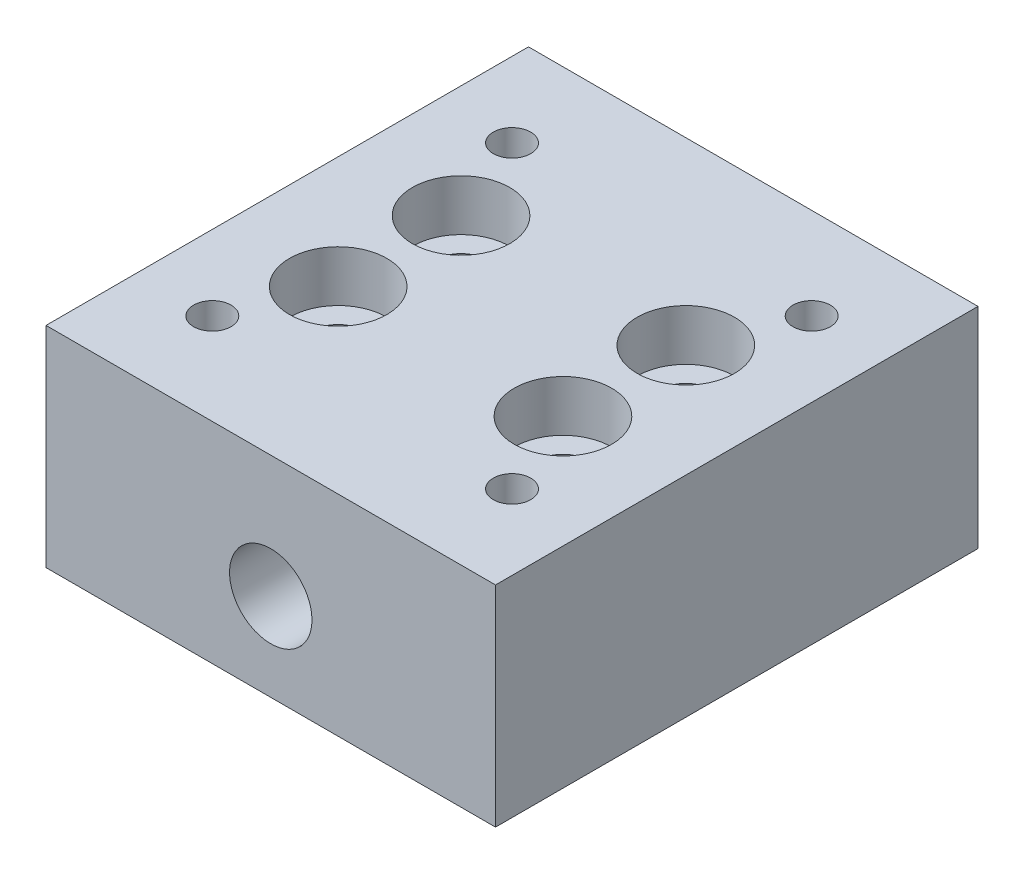
ISO-10303-21;
HEADER;
FILE_DESCRIPTION(('STEP AP214'),'2;1');
FILE_NAME('part.step','',(''),(''),'','','');
FILE_SCHEMA(('AUTOMOTIVE_DESIGN { 1 0 10303 214 1 1 1 1 }'));
ENDSEC;
DATA;
#1=APPLICATION_CONTEXT('core data for automotive mechanical design processes');
#2=APPLICATION_PROTOCOL_DEFINITION('international standard','automotive_design',2000,#1);
#3=PRODUCT_CONTEXT('',#1,'mechanical');
#4=PRODUCT('Part','Part','',(#3));
#5=PRODUCT_RELATED_PRODUCT_CATEGORY('part','',(#4));
#6=PRODUCT_DEFINITION_FORMATION('','',#4);
#7=PRODUCT_DEFINITION_CONTEXT('part definition',#1,'design');
#8=PRODUCT_DEFINITION('design','',#6,#7);
#9=PRODUCT_DEFINITION_SHAPE('','',#8);
#10=(LENGTH_UNIT() NAMED_UNIT(*) SI_UNIT(.MILLI.,.METRE.));
#11=(NAMED_UNIT(*) PLANE_ANGLE_UNIT() SI_UNIT($,.RADIAN.));
#12=(NAMED_UNIT(*) SI_UNIT($,.STERADIAN.) SOLID_ANGLE_UNIT());
#13=UNCERTAINTY_MEASURE_WITH_UNIT(LENGTH_MEASURE(1.E-05),#10,'distance_accuracy_value','');
#14=(GEOMETRIC_REPRESENTATION_CONTEXT(3) GLOBAL_UNCERTAINTY_ASSIGNED_CONTEXT((#13)) GLOBAL_UNIT_ASSIGNED_CONTEXT((#10,
#11,#12)) REPRESENTATION_CONTEXT('',''));
#15=CARTESIAN_POINT('',(0.,0.,0.));
#16=DIRECTION('',(0.,0.,1.));
#17=DIRECTION('',(1.,0.,0.));
#18=AXIS2_PLACEMENT_3D('',#15,#16,#17);
#19=CARTESIAN_POINT('',(0.,17.35,18.2724671640334));
#20=DIRECTION('',(0.,0.,1.));
#21=DIRECTION('',(1.,0.,0.));
#22=AXIS2_PLACEMENT_3D('',#19,#20,#21);
#23=CYLINDRICAL_SURFACE('',#22,2.75);
#24=CARTESIAN_POINT('',(0.,17.35,58.2506417570854));
#25=DIRECTION('',(0.,0.,1.));
#26=DIRECTION('',(1.,0.,0.));
#27=AXIS2_PLACEMENT_3D('',#24,#25,#26);
#28=CIRCLE('',#27,2.75);
#29=CARTESIAN_POINT('',(2.75,17.35,58.2506417570854));
#30=VERTEX_POINT('',#29);
#31=EDGE_CURVE('E173',#30,#30,#28,.T.);
#32=ORIENTED_EDGE('',*,*,#31,.T.);
#33=EDGE_LOOP('',(#32));
#34=FACE_BOUND('',#33,.T.);
#35=CARTESIAN_POINT('',(0.,17.35,48.0506417570856));
#36=DIRECTION('',(0.,0.,-1.));
#37=DIRECTION('',(0.,1.,0.));
#38=AXIS2_PLACEMENT_3D('',#35,#36,#37);
#39=CIRCLE('',#38,2.75);
#40=CARTESIAN_POINT('',(0.,20.1,48.0506417570856));
#41=VERTEX_POINT('',#40);
#42=EDGE_CURVE('E51',#41,#41,#39,.F.);
#43=ORIENTED_EDGE('',*,*,#42,.F.);
#44=EDGE_LOOP('',(#43));
#45=FACE_BOUND('',#44,.T.);
#46=ADVANCED_FACE('F47',(#34,#45),#23,.F.);
#47=CARTESIAN_POINT('',(2.5,17.3499999999999,32.0506417570856));
#48=DIRECTION('',(0.,0.,-1.));
#49=DIRECTION('',(0.,1.,0.));
#50=AXIS2_PLACEMENT_3D('',#47,#48,#49);
#51=PLANE('',#50);
#52=CARTESIAN_POINT('',(0.,17.35,32.0506417570856));
#53=DIRECTION('',(0.,0.,-1.));
#54=DIRECTION('',(0.,1.,0.));
#55=AXIS2_PLACEMENT_3D('',#52,#53,#54);
#56=CIRCLE('',#55,5.);
#57=CARTESIAN_POINT('',(0.,22.3499999999999,32.0506417570856));
#58=VERTEX_POINT('',#57);
#59=CARTESIAN_POINT('',(0.,12.3499999999999,32.0506417570855));
#60=VERTEX_POINT('',#59);
#61=EDGE_CURVE('E62',#58,#60,#56,.T.);
#62=ORIENTED_EDGE('',*,*,#61,.F.);
#63=DIRECTION('',(1.,0.,0.));
#64=VECTOR('',#63,1.);
#65=CARTESIAN_POINT('',(2.5,22.3499999999999,32.0506417570856));
#66=LINE('',#65,#64);
#67=CARTESIAN_POINT('',(2.5,22.3499999999999,32.0506417570856));
#68=VERTEX_POINT('',#67);
#69=EDGE_CURVE('E142',#58,#68,#66,.T.);
#70=ORIENTED_EDGE('',*,*,#69,.T.);
#71=CARTESIAN_POINT('',(2.5,17.3499999999999,32.0506417570856));
#72=DIRECTION('',(0.,0.,-1.));
#73=DIRECTION('',(0.,1.,0.));
#74=AXIS2_PLACEMENT_3D('',#71,#72,#73);
#75=CIRCLE('',#74,5.);
#76=CARTESIAN_POINT('',(2.5,12.3499999999999,32.0506417570855));
#77=VERTEX_POINT('',#76);
#78=EDGE_CURVE('E171',#68,#77,#75,.T.);
#79=ORIENTED_EDGE('',*,*,#78,.T.);
#80=DIRECTION('',(-1.,0.,0.));
#81=VECTOR('',#80,1.);
#82=CARTESIAN_POINT('',(2.5,12.3499999999999,32.0506417570855));
#83=LINE('',#82,#81);
#84=EDGE_CURVE('E145',#77,#60,#83,.T.);
#85=ORIENTED_EDGE('',*,*,#84,.T.);
#86=EDGE_LOOP('',(#62,#70,#79,#85));
#87=FACE_BOUND('',#86,.T.);
#88=ADVANCED_FACE('F140',(#87),#51,.T.);
#89=CARTESIAN_POINT('',(0.,11.5,0.));
#90=DIRECTION('',(0.,1.,0.));
#91=DIRECTION('',(0.,0.,1.));
#92=AXIS2_PLACEMENT_3D('',#89,#90,#91);
#93=PLANE('',#92);
#94=CARTESIAN_POINT('',(-7.5,11.5,38.0506417570854));
#95=DIRECTION('',(0.,1.,0.));
#96=DIRECTION('',(0.,0.,1.));
#97=AXIS2_PLACEMENT_3D('',#94,#95,#96);
#98=CIRCLE('',#97,1.7);
#99=CARTESIAN_POINT('',(-7.5,11.5,39.7506417570854));
#100=VERTEX_POINT('',#99);
#101=EDGE_CURVE('E205',#100,#100,#98,.F.);
#102=ORIENTED_EDGE('',*,*,#101,.F.);
#103=EDGE_LOOP('',(#102));
#104=FACE_BOUND('',#103,.T.);
#105=CARTESIAN_POINT('',(7.5,11.5,38.0506417570854));
#106=DIRECTION('',(0.,1.,0.));
#107=DIRECTION('',(0.,0.,1.));
#108=AXIS2_PLACEMENT_3D('',#105,#106,#107);
#109=CIRCLE('',#108,1.7);
#110=CARTESIAN_POINT('',(7.5,11.5,39.7506417570854));
#111=VERTEX_POINT('',#110);
#112=EDGE_CURVE('E229',#111,#111,#109,.F.);
#113=ORIENTED_EDGE('',*,*,#112,.F.);
#114=EDGE_LOOP('',(#113));
#115=FACE_BOUND('',#114,.T.);
#116=CARTESIAN_POINT('',(7.5,11.5,46.2506417570854));
#117=DIRECTION('',(0.,1.,0.));
#118=DIRECTION('',(0.,0.,1.));
#119=AXIS2_PLACEMENT_3D('',#116,#117,#118);
#120=CIRCLE('',#119,1.7);
#121=CARTESIAN_POINT('',(7.5,11.5,47.9506417570854));
#122=VERTEX_POINT('',#121);
#123=EDGE_CURVE('E241',#122,#122,#120,.F.);
#124=ORIENTED_EDGE('',*,*,#123,.F.);
#125=EDGE_LOOP('',(#124));
#126=FACE_BOUND('',#125,.T.);
#127=DIRECTION('',(0.,0.,1.));
#128=VECTOR('',#127,1.);
#129=CARTESIAN_POINT('',(-15.,11.5,26.0506417570854));
#130=LINE('',#129,#128);
#131=CARTESIAN_POINT('',(-15.,11.5,26.0506417570854));
#132=VERTEX_POINT('',#131);
#133=CARTESIAN_POINT('',(-15.,11.5,58.2506417570854));
#134=VERTEX_POINT('',#133);
#135=EDGE_CURVE('E244',#132,#134,#130,.T.);
#136=ORIENTED_EDGE('',*,*,#135,.F.);
#137=DIRECTION('',(-1.,0.,0.));
#138=VECTOR('',#137,1.);
#139=CARTESIAN_POINT('',(-15.,11.5,26.0506417570854));
#140=LINE('',#139,#138);
#141=CARTESIAN_POINT('',(15.,11.5,26.0506417570854));
#142=VERTEX_POINT('',#141);
#143=EDGE_CURVE('E257',#142,#132,#140,.T.);
#144=ORIENTED_EDGE('',*,*,#143,.F.);
#145=DIRECTION('',(0.,0.,-1.));
#146=VECTOR('',#145,1.);
#147=CARTESIAN_POINT('',(15.,11.5,26.0506417570854));
#148=LINE('',#147,#146);
#149=CARTESIAN_POINT('',(15.,11.5,58.2506417570854));
#150=VERTEX_POINT('',#149);
#151=EDGE_CURVE('E268',#150,#142,#148,.T.);
#152=ORIENTED_EDGE('',*,*,#151,.F.);
#153=DIRECTION('',(1.,0.,0.));
#154=VECTOR('',#153,1.);
#155=CARTESIAN_POINT('',(-15.,11.5,58.2506417570854));
#156=LINE('',#155,#154);
#157=EDGE_CURVE('E266',#134,#150,#156,.T.);
#158=ORIENTED_EDGE('',*,*,#157,.F.);
#159=EDGE_LOOP('',(#136,#144,#152,#158));
#160=FACE_BOUND('',#159,.T.);
#161=CARTESIAN_POINT('',(-7.5,11.5,46.2506417570854));
#162=DIRECTION('',(0.,1.,0.));
#163=DIRECTION('',(0.,0.,1.));
#164=AXIS2_PLACEMENT_3D('',#161,#162,#163);
#165=CIRCLE('',#164,1.7);
#166=CARTESIAN_POINT('',(-7.5,11.5,47.9506417570854));
#167=VERTEX_POINT('',#166);
#168=EDGE_CURVE('E217',#167,#167,#165,.F.);
#169=ORIENTED_EDGE('',*,*,#168,.F.);
#170=EDGE_LOOP('',(#169));
#171=FACE_BOUND('',#170,.T.);
#172=ADVANCED_FACE('F287',(#104,#115,#126,#160,#171),#93,.F.);
#173=CARTESIAN_POINT('',(-15.,25.5,26.0506417570854));
#174=DIRECTION('',(1.,0.,0.));
#175=DIRECTION('',(0.,0.,-1.));
#176=AXIS2_PLACEMENT_3D('',#173,#174,#175);
#177=PLANE('',#176);
#178=ORIENTED_EDGE('',*,*,#135,.T.);
#179=DIRECTION('',(0.,-1.,0.));
#180=VECTOR('',#179,1.);
#181=CARTESIAN_POINT('',(-15.,25.5,58.2506417570854));
#182=LINE('',#181,#180);
#183=CARTESIAN_POINT('',(-15.,25.5,58.2506417570854));
#184=VERTEX_POINT('',#183);
#185=EDGE_CURVE('E11',#184,#134,#182,.T.);
#186=ORIENTED_EDGE('',*,*,#185,.F.);
#187=DIRECTION('',(0.,0.,1.));
#188=VECTOR('',#187,1.);
#189=CARTESIAN_POINT('',(-15.,25.5,26.0506417570854));
#190=LINE('',#189,#188);
#191=CARTESIAN_POINT('',(-15.,25.5,26.0506417570854));
#192=VERTEX_POINT('',#191);
#193=EDGE_CURVE('E253',#192,#184,#190,.T.);
#194=ORIENTED_EDGE('',*,*,#193,.F.);
#195=DIRECTION('',(0.,-1.,0.));
#196=VECTOR('',#195,1.);
#197=CARTESIAN_POINT('',(-15.,25.5,26.0506417570854));
#198=LINE('',#197,#196);
#199=EDGE_CURVE('E263',#192,#132,#198,.T.);
#200=ORIENTED_EDGE('',*,*,#199,.T.);
#201=EDGE_LOOP('',(#178,#186,#194,#200));
#202=FACE_BOUND('',#201,.T.);
#203=ADVANCED_FACE('F49',(#202),#177,.F.);
#204=CARTESIAN_POINT('',(-15.,25.5,58.2506417570854));
#205=DIRECTION('',(0.,0.,-1.));
#206=DIRECTION('',(-1.,0.,0.));
#207=AXIS2_PLACEMENT_3D('',#204,#205,#206);
#208=PLANE('',#207);
#209=ORIENTED_EDGE('',*,*,#31,.F.);
#210=EDGE_LOOP('',(#209));
#211=FACE_BOUND('',#210,.T.);
#212=ORIENTED_EDGE('',*,*,#157,.T.);
#213=DIRECTION('',(0.,-1.,0.));
#214=VECTOR('',#213,1.);
#215=CARTESIAN_POINT('',(15.,25.5,58.2506417570854));
#216=LINE('',#215,#214);
#217=CARTESIAN_POINT('',(15.,25.5,58.2506417570854));
#218=VERTEX_POINT('',#217);
#219=EDGE_CURVE('E56',#218,#150,#216,.T.);
#220=ORIENTED_EDGE('',*,*,#219,.F.);
#221=DIRECTION('',(1.,0.,0.));
#222=VECTOR('',#221,1.);
#223=CARTESIAN_POINT('',(-15.,25.5,58.2506417570854));
#224=LINE('',#223,#222);
#225=EDGE_CURVE('E256',#184,#218,#224,.T.);
#226=ORIENTED_EDGE('',*,*,#225,.F.);
#227=ORIENTED_EDGE('',*,*,#185,.T.);
#228=EDGE_LOOP('',(#212,#220,#226,#227));
#229=FACE_BOUND('',#228,.T.);
#230=ADVANCED_FACE('F298',(#211,#229),#208,.F.);
#231=CARTESIAN_POINT('',(15.,25.5,26.0506417570854));
#232=DIRECTION('',(-1.,0.,0.));
#233=DIRECTION('',(0.,0.,1.));
#234=AXIS2_PLACEMENT_3D('',#231,#232,#233);
#235=PLANE('',#234);
#236=ORIENTED_EDGE('',*,*,#151,.T.);
#237=DIRECTION('',(0.,-1.,0.));
#238=VECTOR('',#237,1.);
#239=CARTESIAN_POINT('',(15.,25.5,26.0506417570854));
#240=LINE('',#239,#238);
#241=CARTESIAN_POINT('',(15.,25.5,26.0506417570854));
#242=VERTEX_POINT('',#241);
#243=EDGE_CURVE('E273',#242,#142,#240,.T.);
#244=ORIENTED_EDGE('',*,*,#243,.F.);
#245=DIRECTION('',(0.,0.,-1.));
#246=VECTOR('',#245,1.);
#247=CARTESIAN_POINT('',(15.,25.5,26.0506417570854));
#248=LINE('',#247,#246);
#249=EDGE_CURVE('E259',#218,#242,#248,.T.);
#250=ORIENTED_EDGE('',*,*,#249,.F.);
#251=ORIENTED_EDGE('',*,*,#219,.T.);
#252=EDGE_LOOP('',(#236,#244,#250,#251));
#253=FACE_BOUND('',#252,.T.);
#254=ADVANCED_FACE('F281',(#253),#235,.F.);
#255=CARTESIAN_POINT('',(-15.,25.5,26.0506417570854));
#256=DIRECTION('',(0.,0.,1.));
#257=DIRECTION('',(1.,0.,0.));
#258=AXIS2_PLACEMENT_3D('',#255,#256,#257);
#259=PLANE('',#258);
#260=DIRECTION('',(-1.,0.,0.));
#261=VECTOR('',#260,1.);
#262=CARTESIAN_POINT('',(2.5,12.35,26.0506417570855));
#263=LINE('',#262,#261);
#264=CARTESIAN_POINT('',(2.5,12.35,26.0506417570854));
#265=VERTEX_POINT('',#264);
#266=CARTESIAN_POINT('',(-2.5,12.35,26.0506417570855));
#267=VERTEX_POINT('',#266);
#268=EDGE_CURVE('E164',#265,#267,#263,.T.);
#269=ORIENTED_EDGE('',*,*,#268,.F.);
#270=CARTESIAN_POINT('',(2.5,17.35,26.0506417570856));
#271=DIRECTION('',(0.,0.,-1.));
#272=DIRECTION('',(0.,1.,0.));
#273=AXIS2_PLACEMENT_3D('',#270,#271,#272);
#274=CIRCLE('',#273,5.);
#275=CARTESIAN_POINT('',(2.5,22.35,26.0506417570856));
#276=VERTEX_POINT('',#275);
#277=EDGE_CURVE('E70',#276,#265,#274,.T.);
#278=ORIENTED_EDGE('',*,*,#277,.F.);
#279=DIRECTION('',(1.,0.,0.));
#280=VECTOR('',#279,1.);
#281=CARTESIAN_POINT('',(2.5,22.35,26.0506417570856));
#282=LINE('',#281,#280);
#283=CARTESIAN_POINT('',(-2.5,22.35,26.0506417570856));
#284=VERTEX_POINT('',#283);
#285=EDGE_CURVE('E169',#284,#276,#282,.T.);
#286=ORIENTED_EDGE('',*,*,#285,.F.);
#287=CARTESIAN_POINT('',(-2.5,17.35,26.0506417570856));
#288=DIRECTION('',(0.,0.,-1.));
#289=DIRECTION('',(0.,1.,0.));
#290=AXIS2_PLACEMENT_3D('',#287,#288,#289);
#291=CIRCLE('',#290,5.);
#292=EDGE_CURVE('E166',#267,#284,#291,.T.);
#293=ORIENTED_EDGE('',*,*,#292,.F.);
#294=EDGE_LOOP('',(#269,#278,#286,#293));
#295=FACE_BOUND('',#294,.T.);
#296=ORIENTED_EDGE('',*,*,#143,.T.);
#297=ORIENTED_EDGE('',*,*,#199,.F.);
#298=DIRECTION('',(-1.,0.,0.));
#299=VECTOR('',#298,1.);
#300=CARTESIAN_POINT('',(-15.,25.5,26.0506417570854));
#301=LINE('',#300,#299);
#302=EDGE_CURVE('E261',#242,#192,#301,.T.);
#303=ORIENTED_EDGE('',*,*,#302,.F.);
#304=ORIENTED_EDGE('',*,*,#243,.T.);
#305=EDGE_LOOP('',(#296,#297,#303,#304));
#306=FACE_BOUND('',#305,.T.);
#307=ADVANCED_FACE('F291',(#295,#306),#259,.F.);
#308=CARTESIAN_POINT('',(0.,25.5,0.));
#309=DIRECTION('',(0.,1.,0.));
#310=DIRECTION('',(0.,0.,1.));
#311=AXIS2_PLACEMENT_3D('',#308,#309,#310);
#312=PLANE('',#311);
#313=CARTESIAN_POINT('',(-9.99999999999999,25.4999999999997,32.1506417570854));
#314=DIRECTION('',(0.,1.,0.));
#315=DIRECTION('',(0.,0.,1.));
#316=AXIS2_PLACEMENT_3D('',#313,#314,#315);
#317=CIRCLE('',#316,1.25);
#318=CARTESIAN_POINT('',(-9.99999999999999,25.4999999999997,33.4006417570854));
#319=VERTEX_POINT('',#318);
#320=EDGE_CURVE('E180',#319,#319,#317,.T.);
#321=ORIENTED_EDGE('',*,*,#320,.F.);
#322=EDGE_LOOP('',(#321));
#323=FACE_BOUND('',#322,.T.);
#324=CARTESIAN_POINT('',(10.,25.4999999999997,32.1506417570854));
#325=DIRECTION('',(0.,1.,0.));
#326=DIRECTION('',(0.,0.,1.));
#327=AXIS2_PLACEMENT_3D('',#324,#325,#326);
#328=CIRCLE('',#327,1.25);
#329=CARTESIAN_POINT('',(10.,25.4999999999997,33.4006417570854));
#330=VERTEX_POINT('',#329);
#331=EDGE_CURVE('E186',#330,#330,#328,.T.);
#332=ORIENTED_EDGE('',*,*,#331,.F.);
#333=EDGE_LOOP('',(#332));
#334=FACE_BOUND('',#333,.T.);
#335=CARTESIAN_POINT('',(10.,25.4999999999995,52.1506417570854));
#336=DIRECTION('',(0.,1.,0.));
#337=DIRECTION('',(0.,0.,1.));
#338=AXIS2_PLACEMENT_3D('',#335,#336,#337);
#339=CIRCLE('',#338,1.25);
#340=CARTESIAN_POINT('',(10.,25.4999999999995,53.4006417570854));
#341=VERTEX_POINT('',#340);
#342=EDGE_CURVE('E192',#341,#341,#339,.T.);
#343=ORIENTED_EDGE('',*,*,#342,.F.);
#344=EDGE_LOOP('',(#343));
#345=FACE_BOUND('',#344,.T.);
#346=CARTESIAN_POINT('',(-9.99999999999999,25.4999999999995,52.1506417570854));
#347=DIRECTION('',(0.,1.,0.));
#348=DIRECTION('',(0.,0.,1.));
#349=AXIS2_PLACEMENT_3D('',#346,#347,#348);
#350=CIRCLE('',#349,1.25);
#351=CARTESIAN_POINT('',(-9.99999999999999,25.4999999999995,53.4006417570854));
#352=VERTEX_POINT('',#351);
#353=EDGE_CURVE('E198',#352,#352,#350,.T.);
#354=ORIENTED_EDGE('',*,*,#353,.F.);
#355=EDGE_LOOP('',(#354));
#356=FACE_BOUND('',#355,.T.);
#357=CARTESIAN_POINT('',(-7.5,25.4999999999996,38.0506417570854));
#358=DIRECTION('',(0.,1.,0.));
#359=DIRECTION('',(0.,0.,1.));
#360=AXIS2_PLACEMENT_3D('',#357,#358,#359);
#361=CIRCLE('',#360,3.25);
#362=CARTESIAN_POINT('',(-7.5,25.4999999999996,41.3006417570854));
#363=VERTEX_POINT('',#362);
#364=EDGE_CURVE('E204',#363,#363,#361,.T.);
#365=ORIENTED_EDGE('',*,*,#364,.F.);
#366=EDGE_LOOP('',(#365));
#367=FACE_BOUND('',#366,.T.);
#368=CARTESIAN_POINT('',(-7.5,25.4999999999995,46.2506417570854));
#369=DIRECTION('',(0.,1.,0.));
#370=DIRECTION('',(0.,0.,1.));
#371=AXIS2_PLACEMENT_3D('',#368,#369,#370);
#372=CIRCLE('',#371,3.25);
#373=CARTESIAN_POINT('',(-7.5,25.4999999999995,49.5006417570854));
#374=VERTEX_POINT('',#373);
#375=EDGE_CURVE('E208',#374,#374,#372,.T.);
#376=ORIENTED_EDGE('',*,*,#375,.F.);
#377=EDGE_LOOP('',(#376));
#378=FACE_BOUND('',#377,.T.);
#379=CARTESIAN_POINT('',(7.5,25.4999999999996,38.0506417570854));
#380=DIRECTION('',(0.,1.,0.));
#381=DIRECTION('',(0.,0.,1.));
#382=AXIS2_PLACEMENT_3D('',#379,#380,#381);
#383=CIRCLE('',#382,3.25);
#384=CARTESIAN_POINT('',(7.5,25.4999999999996,41.3006417570854));
#385=VERTEX_POINT('',#384);
#386=EDGE_CURVE('E220',#385,#385,#383,.T.);
#387=ORIENTED_EDGE('',*,*,#386,.F.);
#388=EDGE_LOOP('',(#387));
#389=FACE_BOUND('',#388,.T.);
#390=CARTESIAN_POINT('',(7.5,25.4999999999995,46.2506417570854));
#391=DIRECTION('',(0.,1.,0.));
#392=DIRECTION('',(0.,0.,1.));
#393=AXIS2_PLACEMENT_3D('',#390,#391,#392);
#394=CIRCLE('',#393,3.25);
#395=CARTESIAN_POINT('',(7.5,25.4999999999995,49.5006417570854));
#396=VERTEX_POINT('',#395);
#397=EDGE_CURVE('E232',#396,#396,#394,.T.);
#398=ORIENTED_EDGE('',*,*,#397,.F.);
#399=EDGE_LOOP('',(#398));
#400=FACE_BOUND('',#399,.T.);
#401=ORIENTED_EDGE('',*,*,#193,.T.);
#402=ORIENTED_EDGE('',*,*,#225,.T.);
#403=ORIENTED_EDGE('',*,*,#249,.T.);
#404=ORIENTED_EDGE('',*,*,#302,.T.);
#405=EDGE_LOOP('',(#401,#402,#403,#404));
#406=FACE_BOUND('',#405,.T.);
#407=ADVANCED_FACE('F297',(#323,#334,#345,#356,#367,#378,#389,#400,#406),#312,.T.);
#408=CARTESIAN_POINT('',(7.5,25.4999999999995,46.2506417570854));
#409=DIRECTION('',(0.,1.,0.));
#410=DIRECTION('',(0.,0.,1.));
#411=AXIS2_PLACEMENT_3D('',#408,#409,#410);
#412=CYLINDRICAL_SURFACE('',#411,1.7);
#413=ORIENTED_EDGE('',*,*,#123,.T.);
#414=EDGE_LOOP('',(#413));
#415=FACE_BOUND('',#414,.T.);
#416=CARTESIAN_POINT('',(7.5,22.0999999999995,46.2506417570854));
#417=DIRECTION('',(0.,1.,0.));
#418=DIRECTION('',(0.,0.,1.));
#419=AXIS2_PLACEMENT_3D('',#416,#417,#418);
#420=CIRCLE('',#419,1.7);
#421=CARTESIAN_POINT('',(7.5,22.0999999999995,47.9506417570854));
#422=VERTEX_POINT('',#421);
#423=EDGE_CURVE('E245',#422,#422,#420,.T.);
#424=ORIENTED_EDGE('',*,*,#423,.T.);
#425=EDGE_LOOP('',(#424));
#426=FACE_BOUND('',#425,.T.);
#427=ADVANCED_FACE('F397',(#415,#426),#412,.F.);
#428=CARTESIAN_POINT('',(9.2,22.0999999999995,46.2506417570854));
#429=DIRECTION('',(0.,-1.,0.));
#430=DIRECTION('',(0.,0.,-1.));
#431=AXIS2_PLACEMENT_3D('',#428,#429,#430);
#432=PLANE('',#431);
#433=ORIENTED_EDGE('',*,*,#423,.F.);
#434=EDGE_LOOP('',(#433));
#435=FACE_BOUND('',#434,.T.);
#436=CARTESIAN_POINT('',(7.5,22.0999999999995,46.2506417570854));
#437=DIRECTION('',(0.,1.,0.));
#438=DIRECTION('',(0.,0.,1.));
#439=AXIS2_PLACEMENT_3D('',#436,#437,#438);
#440=CIRCLE('',#439,3.25);
#441=CARTESIAN_POINT('',(7.5,22.0999999999995,49.5006417570854));
#442=VERTEX_POINT('',#441);
#443=EDGE_CURVE('E248',#442,#442,#440,.T.);
#444=ORIENTED_EDGE('',*,*,#443,.T.);
#445=EDGE_LOOP('',(#444));
#446=FACE_BOUND('',#445,.T.);
#447=ADVANCED_FACE('F393',(#435,#446),#432,.F.);
#448=CARTESIAN_POINT('',(7.5,25.4999999999995,46.2506417570854));
#449=DIRECTION('',(0.,1.,0.));
#450=DIRECTION('',(0.,0.,1.));
#451=AXIS2_PLACEMENT_3D('',#448,#449,#450);
#452=CYLINDRICAL_SURFACE('',#451,3.25);
#453=ORIENTED_EDGE('',*,*,#443,.F.);
#454=EDGE_LOOP('',(#453));
#455=FACE_BOUND('',#454,.T.);
#456=ORIENTED_EDGE('',*,*,#397,.T.);
#457=EDGE_LOOP('',(#456));
#458=FACE_BOUND('',#457,.T.);
#459=ADVANCED_FACE('F389',(#455,#458),#452,.F.);
#460=CARTESIAN_POINT('',(7.5,25.4999999999996,38.0506417570854));
#461=DIRECTION('',(0.,1.,0.));
#462=DIRECTION('',(0.,0.,1.));
#463=AXIS2_PLACEMENT_3D('',#460,#461,#462);
#464=CYLINDRICAL_SURFACE('',#463,1.7);
#465=ORIENTED_EDGE('',*,*,#112,.T.);
#466=EDGE_LOOP('',(#465));
#467=FACE_BOUND('',#466,.T.);
#468=CARTESIAN_POINT('',(7.5,22.0999999999996,38.0506417570854));
#469=DIRECTION('',(0.,1.,0.));
#470=DIRECTION('',(0.,0.,1.));
#471=AXIS2_PLACEMENT_3D('',#468,#469,#470);
#472=CIRCLE('',#471,1.7);
#473=CARTESIAN_POINT('',(7.5,22.0999999999996,39.7506417570854));
#474=VERTEX_POINT('',#473);
#475=EDGE_CURVE('E233',#474,#474,#472,.T.);
#476=ORIENTED_EDGE('',*,*,#475,.T.);
#477=EDGE_LOOP('',(#476));
#478=FACE_BOUND('',#477,.T.);
#479=ADVANCED_FACE('F385',(#467,#478),#464,.F.);
#480=CARTESIAN_POINT('',(9.2,22.0999999999996,38.0506417570854));
#481=DIRECTION('',(0.,-1.,0.));
#482=DIRECTION('',(0.,0.,-1.));
#483=AXIS2_PLACEMENT_3D('',#480,#481,#482);
#484=PLANE('',#483);
#485=ORIENTED_EDGE('',*,*,#475,.F.);
#486=EDGE_LOOP('',(#485));
#487=FACE_BOUND('',#486,.T.);
#488=CARTESIAN_POINT('',(7.5,22.0999999999996,38.0506417570854));
#489=DIRECTION('',(0.,1.,0.));
#490=DIRECTION('',(0.,0.,1.));
#491=AXIS2_PLACEMENT_3D('',#488,#489,#490);
#492=CIRCLE('',#491,3.25);
#493=CARTESIAN_POINT('',(7.5,22.0999999999996,41.3006417570854));
#494=VERTEX_POINT('',#493);
#495=EDGE_CURVE('E236',#494,#494,#492,.T.);
#496=ORIENTED_EDGE('',*,*,#495,.T.);
#497=EDGE_LOOP('',(#496));
#498=FACE_BOUND('',#497,.T.);
#499=ADVANCED_FACE('F381',(#487,#498),#484,.F.);
#500=CARTESIAN_POINT('',(7.5,25.4999999999996,38.0506417570854));
#501=DIRECTION('',(0.,1.,0.));
#502=DIRECTION('',(0.,0.,1.));
#503=AXIS2_PLACEMENT_3D('',#500,#501,#502);
#504=CYLINDRICAL_SURFACE('',#503,3.25);
#505=ORIENTED_EDGE('',*,*,#495,.F.);
#506=EDGE_LOOP('',(#505));
#507=FACE_BOUND('',#506,.T.);
#508=ORIENTED_EDGE('',*,*,#386,.T.);
#509=EDGE_LOOP('',(#508));
#510=FACE_BOUND('',#509,.T.);
#511=ADVANCED_FACE('F377',(#507,#510),#504,.F.);
#512=CARTESIAN_POINT('',(-7.5,25.4999999999995,46.2506417570854));
#513=DIRECTION('',(0.,1.,0.));
#514=DIRECTION('',(0.,0.,1.));
#515=AXIS2_PLACEMENT_3D('',#512,#513,#514);
#516=CYLINDRICAL_SURFACE('',#515,1.7);
#517=ORIENTED_EDGE('',*,*,#168,.T.);
#518=EDGE_LOOP('',(#517));
#519=FACE_BOUND('',#518,.T.);
#520=CARTESIAN_POINT('',(-7.5,22.0999999999995,46.2506417570854));
#521=DIRECTION('',(0.,1.,0.));
#522=DIRECTION('',(0.,0.,1.));
#523=AXIS2_PLACEMENT_3D('',#520,#521,#522);
#524=CIRCLE('',#523,1.7);
#525=CARTESIAN_POINT('',(-7.5,22.0999999999995,47.9506417570854));
#526=VERTEX_POINT('',#525);
#527=EDGE_CURVE('E221',#526,#526,#524,.T.);
#528=ORIENTED_EDGE('',*,*,#527,.T.);
#529=EDGE_LOOP('',(#528));
#530=FACE_BOUND('',#529,.T.);
#531=ADVANCED_FACE('F373',(#519,#530),#516,.F.);
#532=CARTESIAN_POINT('',(-5.8,22.0999999999995,46.2506417570854));
#533=DIRECTION('',(0.,-1.,0.));
#534=DIRECTION('',(0.,0.,-1.));
#535=AXIS2_PLACEMENT_3D('',#532,#533,#534);
#536=PLANE('',#535);
#537=ORIENTED_EDGE('',*,*,#527,.F.);
#538=EDGE_LOOP('',(#537));
#539=FACE_BOUND('',#538,.T.);
#540=CARTESIAN_POINT('',(-7.5,22.0999999999995,46.2506417570854));
#541=DIRECTION('',(0.,1.,0.));
#542=DIRECTION('',(0.,0.,1.));
#543=AXIS2_PLACEMENT_3D('',#540,#541,#542);
#544=CIRCLE('',#543,3.25);
#545=CARTESIAN_POINT('',(-7.5,22.0999999999995,49.5006417570854));
#546=VERTEX_POINT('',#545);
#547=EDGE_CURVE('E224',#546,#546,#544,.T.);
#548=ORIENTED_EDGE('',*,*,#547,.T.);
#549=EDGE_LOOP('',(#548));
#550=FACE_BOUND('',#549,.T.);
#551=ADVANCED_FACE('F369',(#539,#550),#536,.F.);
#552=CARTESIAN_POINT('',(-7.5,25.4999999999995,46.2506417570854));
#553=DIRECTION('',(0.,1.,0.));
#554=DIRECTION('',(0.,0.,1.));
#555=AXIS2_PLACEMENT_3D('',#552,#553,#554);
#556=CYLINDRICAL_SURFACE('',#555,3.25);
#557=ORIENTED_EDGE('',*,*,#547,.F.);
#558=EDGE_LOOP('',(#557));
#559=FACE_BOUND('',#558,.T.);
#560=ORIENTED_EDGE('',*,*,#375,.T.);
#561=EDGE_LOOP('',(#560));
#562=FACE_BOUND('',#561,.T.);
#563=ADVANCED_FACE('F365',(#559,#562),#556,.F.);
#564=CARTESIAN_POINT('',(-7.5,25.4999999999996,38.0506417570854));
#565=DIRECTION('',(0.,1.,0.));
#566=DIRECTION('',(0.,0.,1.));
#567=AXIS2_PLACEMENT_3D('',#564,#565,#566);
#568=CYLINDRICAL_SURFACE('',#567,1.7);
#569=ORIENTED_EDGE('',*,*,#101,.T.);
#570=EDGE_LOOP('',(#569));
#571=FACE_BOUND('',#570,.T.);
#572=CARTESIAN_POINT('',(-7.5,22.0999999999996,38.0506417570854));
#573=DIRECTION('',(0.,1.,0.));
#574=DIRECTION('',(0.,0.,1.));
#575=AXIS2_PLACEMENT_3D('',#572,#573,#574);
#576=CIRCLE('',#575,1.7);
#577=CARTESIAN_POINT('',(-7.5,22.0999999999996,39.7506417570854));
#578=VERTEX_POINT('',#577);
#579=EDGE_CURVE('E209',#578,#578,#576,.T.);
#580=ORIENTED_EDGE('',*,*,#579,.T.);
#581=EDGE_LOOP('',(#580));
#582=FACE_BOUND('',#581,.T.);
#583=ADVANCED_FACE('F361',(#571,#582),#568,.F.);
#584=CARTESIAN_POINT('',(-5.8,22.0999999999996,38.0506417570854));
#585=DIRECTION('',(0.,-1.,0.));
#586=DIRECTION('',(0.,0.,-1.));
#587=AXIS2_PLACEMENT_3D('',#584,#585,#586);
#588=PLANE('',#587);
#589=ORIENTED_EDGE('',*,*,#579,.F.);
#590=EDGE_LOOP('',(#589));
#591=FACE_BOUND('',#590,.T.);
#592=CARTESIAN_POINT('',(-7.5,22.0999999999996,38.0506417570854));
#593=DIRECTION('',(0.,1.,0.));
#594=DIRECTION('',(0.,0.,1.));
#595=AXIS2_PLACEMENT_3D('',#592,#593,#594);
#596=CIRCLE('',#595,3.25);
#597=CARTESIAN_POINT('',(-7.5,22.0999999999996,41.3006417570854));
#598=VERTEX_POINT('',#597);
#599=EDGE_CURVE('E212',#598,#598,#596,.T.);
#600=ORIENTED_EDGE('',*,*,#599,.T.);
#601=EDGE_LOOP('',(#600));
#602=FACE_BOUND('',#601,.T.);
#603=ADVANCED_FACE('F357',(#591,#602),#588,.F.);
#604=CARTESIAN_POINT('',(-7.5,25.4999999999996,38.0506417570854));
#605=DIRECTION('',(0.,1.,0.));
#606=DIRECTION('',(0.,0.,1.));
#607=AXIS2_PLACEMENT_3D('',#604,#605,#606);
#608=CYLINDRICAL_SURFACE('',#607,3.25);
#609=ORIENTED_EDGE('',*,*,#599,.F.);
#610=EDGE_LOOP('',(#609));
#611=FACE_BOUND('',#610,.T.);
#612=ORIENTED_EDGE('',*,*,#364,.T.);
#613=EDGE_LOOP('',(#612));
#614=FACE_BOUND('',#613,.T.);
#615=ADVANCED_FACE('F353',(#611,#614),#608,.F.);
#616=CARTESIAN_POINT('',(-9.99999999999999,16.9999999999995,52.1506417570854));
#617=DIRECTION('',(0.,1.,0.));
#618=DIRECTION('',(0.,0.,1.));
#619=AXIS2_PLACEMENT_3D('',#616,#617,#618);
#620=CONICAL_SURFACE('',#619,1.25,1.02974425867665);
#621=CARTESIAN_POINT('',(-10.,16.248924226215,52.1506417570854));
#622=VERTEX_POINT('',#621);
#623=VERTEX_LOOP('',#622);
#624=FACE_BOUND('',#623,.T.);
#625=CARTESIAN_POINT('',(-9.99999999999999,16.9999999999995,52.1506417570854));
#626=DIRECTION('',(0.,1.,0.));
#627=DIRECTION('',(0.,0.,1.));
#628=AXIS2_PLACEMENT_3D('',#625,#626,#627);
#629=CIRCLE('',#628,1.25);
#630=CARTESIAN_POINT('',(-9.99999999999999,16.9999999999995,53.4006417570854));
#631=VERTEX_POINT('',#630);
#632=EDGE_CURVE('E201',#631,#631,#629,.T.);
#633=ORIENTED_EDGE('',*,*,#632,.T.);
#634=EDGE_LOOP('',(#633));
#635=FACE_BOUND('',#634,.T.);
#636=ADVANCED_FACE('F349',(#624,#635),#620,.F.);
#637=CARTESIAN_POINT('',(-9.99999999999999,25.4999999999995,52.1506417570854));
#638=DIRECTION('',(0.,1.,0.));
#639=DIRECTION('',(0.,0.,1.));
#640=AXIS2_PLACEMENT_3D('',#637,#638,#639);
#641=CYLINDRICAL_SURFACE('',#640,1.25);
#642=ORIENTED_EDGE('',*,*,#632,.F.);
#643=EDGE_LOOP('',(#642));
#644=FACE_BOUND('',#643,.T.);
#645=ORIENTED_EDGE('',*,*,#353,.T.);
#646=EDGE_LOOP('',(#645));
#647=FACE_BOUND('',#646,.T.);
#648=ADVANCED_FACE('F345',(#644,#647),#641,.F.);
#649=CARTESIAN_POINT('',(10.,16.9999999999995,52.1506417570854));
#650=DIRECTION('',(0.,1.,0.));
#651=DIRECTION('',(0.,0.,1.));
#652=AXIS2_PLACEMENT_3D('',#649,#650,#651);
#653=CONICAL_SURFACE('',#652,1.25,1.02974425867665);
#654=CARTESIAN_POINT('',(10.,16.248924226215,52.1506417570854));
#655=VERTEX_POINT('',#654);
#656=VERTEX_LOOP('',#655);
#657=FACE_BOUND('',#656,.T.);
#658=CARTESIAN_POINT('',(10.,16.9999999999995,52.1506417570854));
#659=DIRECTION('',(0.,1.,0.));
#660=DIRECTION('',(0.,0.,1.));
#661=AXIS2_PLACEMENT_3D('',#658,#659,#660);
#662=CIRCLE('',#661,1.25);
#663=CARTESIAN_POINT('',(10.,16.9999999999995,53.4006417570854));
#664=VERTEX_POINT('',#663);
#665=EDGE_CURVE('E195',#664,#664,#662,.T.);
#666=ORIENTED_EDGE('',*,*,#665,.T.);
#667=EDGE_LOOP('',(#666));
#668=FACE_BOUND('',#667,.T.);
#669=ADVANCED_FACE('F341',(#657,#668),#653,.F.);
#670=CARTESIAN_POINT('',(10.,25.4999999999995,52.1506417570854));
#671=DIRECTION('',(0.,1.,0.));
#672=DIRECTION('',(0.,0.,1.));
#673=AXIS2_PLACEMENT_3D('',#670,#671,#672);
#674=CYLINDRICAL_SURFACE('',#673,1.25);
#675=ORIENTED_EDGE('',*,*,#665,.F.);
#676=EDGE_LOOP('',(#675));
#677=FACE_BOUND('',#676,.T.);
#678=ORIENTED_EDGE('',*,*,#342,.T.);
#679=EDGE_LOOP('',(#678));
#680=FACE_BOUND('',#679,.T.);
#681=ADVANCED_FACE('F337',(#677,#680),#674,.F.);
#682=CARTESIAN_POINT('',(10.,16.9999999999997,32.1506417570854));
#683=DIRECTION('',(0.,1.,0.));
#684=DIRECTION('',(0.,0.,1.));
#685=AXIS2_PLACEMENT_3D('',#682,#683,#684);
#686=CONICAL_SURFACE('',#685,1.25,1.02974425867665);
#687=CARTESIAN_POINT('',(10.,16.2489242262152,32.1506417570854));
#688=VERTEX_POINT('',#687);
#689=VERTEX_LOOP('',#688);
#690=FACE_BOUND('',#689,.T.);
#691=CARTESIAN_POINT('',(10.,16.9999999999997,32.1506417570854));
#692=DIRECTION('',(0.,1.,0.));
#693=DIRECTION('',(0.,0.,1.));
#694=AXIS2_PLACEMENT_3D('',#691,#692,#693);
#695=CIRCLE('',#694,1.25);
#696=CARTESIAN_POINT('',(10.,16.9999999999997,33.4006417570854));
#697=VERTEX_POINT('',#696);
#698=EDGE_CURVE('E189',#697,#697,#695,.T.);
#699=ORIENTED_EDGE('',*,*,#698,.T.);
#700=EDGE_LOOP('',(#699));
#701=FACE_BOUND('',#700,.T.);
#702=ADVANCED_FACE('F333',(#690,#701),#686,.F.);
#703=CARTESIAN_POINT('',(10.,25.4999999999997,32.1506417570854));
#704=DIRECTION('',(0.,1.,0.));
#705=DIRECTION('',(0.,0.,1.));
#706=AXIS2_PLACEMENT_3D('',#703,#704,#705);
#707=CYLINDRICAL_SURFACE('',#706,1.25);
#708=ORIENTED_EDGE('',*,*,#698,.F.);
#709=EDGE_LOOP('',(#708));
#710=FACE_BOUND('',#709,.T.);
#711=ORIENTED_EDGE('',*,*,#331,.T.);
#712=EDGE_LOOP('',(#711));
#713=FACE_BOUND('',#712,.T.);
#714=ADVANCED_FACE('F329',(#710,#713),#707,.F.);
#715=CARTESIAN_POINT('',(-9.99999999999999,16.9999999999997,32.1506417570854));
#716=DIRECTION('',(0.,1.,0.));
#717=DIRECTION('',(0.,0.,1.));
#718=AXIS2_PLACEMENT_3D('',#715,#716,#717);
#719=CONICAL_SURFACE('',#718,1.25,1.02974425867665);
#720=CARTESIAN_POINT('',(-10.,16.2489242262152,32.1506417570854));
#721=VERTEX_POINT('',#720);
#722=VERTEX_LOOP('',#721);
#723=FACE_BOUND('',#722,.T.);
#724=CARTESIAN_POINT('',(-9.99999999999999,16.9999999999997,32.1506417570854));
#725=DIRECTION('',(0.,1.,0.));
#726=DIRECTION('',(0.,0.,1.));
#727=AXIS2_PLACEMENT_3D('',#724,#725,#726);
#728=CIRCLE('',#727,1.25);
#729=CARTESIAN_POINT('',(-9.99999999999999,16.9999999999997,33.4006417570854));
#730=VERTEX_POINT('',#729);
#731=EDGE_CURVE('E183',#730,#730,#728,.T.);
#732=ORIENTED_EDGE('',*,*,#731,.T.);
#733=EDGE_LOOP('',(#732));
#734=FACE_BOUND('',#733,.T.);
#735=ADVANCED_FACE('F325',(#723,#734),#719,.F.);
#736=CARTESIAN_POINT('',(-9.99999999999999,25.4999999999997,32.1506417570854));
#737=DIRECTION('',(0.,1.,0.));
#738=DIRECTION('',(0.,0.,1.));
#739=AXIS2_PLACEMENT_3D('',#736,#737,#738);
#740=CYLINDRICAL_SURFACE('',#739,1.25);
#741=ORIENTED_EDGE('',*,*,#731,.F.);
#742=EDGE_LOOP('',(#741));
#743=FACE_BOUND('',#742,.T.);
#744=ORIENTED_EDGE('',*,*,#320,.T.);
#745=EDGE_LOOP('',(#744));
#746=FACE_BOUND('',#745,.T.);
#747=ADVANCED_FACE('F322',(#743,#746),#740,.F.);
#748=EDGE_CURVE('E129',#60,#58,#56,.T.);
#749=ORIENTED_EDGE('',*,*,#748,.F.);
#750=CARTESIAN_POINT('',(-2.5,12.3499999999999,32.0506417570855));
#751=VERTEX_POINT('',#750);
#752=EDGE_CURVE('E421',#60,#751,#83,.T.);
#753=ORIENTED_EDGE('',*,*,#752,.T.);
#754=CARTESIAN_POINT('',(-2.5,17.3499999999999,32.0506417570856));
#755=DIRECTION('',(0.,0.,-1.));
#756=DIRECTION('',(0.,1.,0.));
#757=AXIS2_PLACEMENT_3D('',#754,#755,#756);
#758=CIRCLE('',#757,5.);
#759=CARTESIAN_POINT('',(-2.5,22.3499999999999,32.0506417570856));
#760=VERTEX_POINT('',#759);
#761=EDGE_CURVE('E152',#751,#760,#758,.T.);
#762=ORIENTED_EDGE('',*,*,#761,.T.);
#763=EDGE_CURVE('E149',#760,#58,#66,.T.);
#764=ORIENTED_EDGE('',*,*,#763,.T.);
#765=EDGE_LOOP('',(#749,#753,#762,#764));
#766=FACE_BOUND('',#765,.T.);
#767=ADVANCED_FACE('F155',(#766),#51,.T.);
#768=CARTESIAN_POINT('',(2.5,17.3499999999999,32.0506417570856));
#769=DIRECTION('',(0.,0.,-1.));
#770=DIRECTION('',(0.,1.,0.));
#771=AXIS2_PLACEMENT_3D('',#768,#769,#770);
#772=CYLINDRICAL_SURFACE('',#771,5.);
#773=ORIENTED_EDGE('',*,*,#277,.T.);
#774=DIRECTION('',(0.,0.,-1.));
#775=VECTOR('',#774,1.);
#776=CARTESIAN_POINT('',(2.5,12.3499999999999,32.0506417570855));
#777=LINE('',#776,#775);
#778=EDGE_CURVE('E157',#77,#265,#777,.T.);
#779=ORIENTED_EDGE('',*,*,#778,.F.);
#780=ORIENTED_EDGE('',*,*,#78,.F.);
#781=DIRECTION('',(0.,0.,-1.));
#782=VECTOR('',#781,1.);
#783=CARTESIAN_POINT('',(2.5,22.3499999999999,32.0506417570856));
#784=LINE('',#783,#782);
#785=EDGE_CURVE('E150',#68,#276,#784,.T.);
#786=ORIENTED_EDGE('',*,*,#785,.T.);
#787=EDGE_LOOP('',(#773,#779,#780,#786));
#788=FACE_BOUND('',#787,.T.);
#789=ADVANCED_FACE('F320',(#788),#772,.F.);
#790=CARTESIAN_POINT('',(2.5,22.3499999999999,32.0506417570856));
#791=DIRECTION('',(0.,1.,0.));
#792=DIRECTION('',(0.,0.,1.));
#793=AXIS2_PLACEMENT_3D('',#790,#791,#792);
#794=PLANE('',#793);
#795=ORIENTED_EDGE('',*,*,#69,.F.);
#796=ORIENTED_EDGE('',*,*,#763,.F.);
#797=DIRECTION('',(0.,0.,-1.));
#798=VECTOR('',#797,1.);
#799=CARTESIAN_POINT('',(-2.5,22.3499999999999,32.0506417570856));
#800=LINE('',#799,#798);
#801=EDGE_CURVE('E174',#760,#284,#800,.T.);
#802=ORIENTED_EDGE('',*,*,#801,.T.);
#803=ORIENTED_EDGE('',*,*,#285,.T.);
#804=ORIENTED_EDGE('',*,*,#785,.F.);
#805=EDGE_LOOP('',(#795,#796,#802,#803,#804));
#806=FACE_BOUND('',#805,.T.);
#807=ADVANCED_FACE('F148',(#806),#794,.F.);
#808=CARTESIAN_POINT('',(-2.5,17.3499999999999,32.0506417570856));
#809=DIRECTION('',(0.,0.,-1.));
#810=DIRECTION('',(0.,1.,0.));
#811=AXIS2_PLACEMENT_3D('',#808,#809,#810);
#812=CYLINDRICAL_SURFACE('',#811,5.);
#813=ORIENTED_EDGE('',*,*,#292,.T.);
#814=ORIENTED_EDGE('',*,*,#801,.F.);
#815=ORIENTED_EDGE('',*,*,#761,.F.);
#816=DIRECTION('',(0.,0.,-1.));
#817=VECTOR('',#816,1.);
#818=CARTESIAN_POINT('',(-2.5,12.3499999999999,32.0506417570855));
#819=LINE('',#818,#817);
#820=EDGE_CURVE('E158',#751,#267,#819,.T.);
#821=ORIENTED_EDGE('',*,*,#820,.T.);
#822=EDGE_LOOP('',(#813,#814,#815,#821));
#823=FACE_BOUND('',#822,.T.);
#824=ADVANCED_FACE('F420',(#823),#812,.F.);
#825=CARTESIAN_POINT('',(2.5,12.3499999999999,32.0506417570855));
#826=DIRECTION('',(0.,-1.,0.));
#827=DIRECTION('',(0.,0.,-1.));
#828=AXIS2_PLACEMENT_3D('',#825,#826,#827);
#829=PLANE('',#828);
#830=ORIENTED_EDGE('',*,*,#752,.F.);
#831=ORIENTED_EDGE('',*,*,#84,.F.);
#832=ORIENTED_EDGE('',*,*,#778,.T.);
#833=ORIENTED_EDGE('',*,*,#268,.T.);
#834=ORIENTED_EDGE('',*,*,#820,.F.);
#835=EDGE_LOOP('',(#830,#831,#832,#833,#834));
#836=FACE_BOUND('',#835,.T.);
#837=ADVANCED_FACE('F418',(#836),#829,.F.);
#838=CARTESIAN_POINT('',(0.,17.3499999999998,48.0506417570856));
#839=DIRECTION('',(0.,0.,-1.));
#840=DIRECTION('',(0.,1.,0.));
#841=AXIS2_PLACEMENT_3D('',#838,#839,#840);
#842=PLANE('',#841);
#843=CARTESIAN_POINT('',(0.,17.3499999999998,48.0506417570856));
#844=DIRECTION('',(0.,0.,-1.));
#845=DIRECTION('',(0.,1.,0.));
#846=AXIS2_PLACEMENT_3D('',#843,#844,#845);
#847=CIRCLE('',#846,5.);
#848=CARTESIAN_POINT('',(0.,22.3499999999998,48.0506417570856));
#849=VERTEX_POINT('',#848);
#850=EDGE_CURVE('E135',#849,#849,#847,.T.);
#851=ORIENTED_EDGE('',*,*,#850,.T.);
#852=EDGE_LOOP('',(#851));
#853=FACE_BOUND('',#852,.T.);
#854=ORIENTED_EDGE('',*,*,#42,.T.);
#855=EDGE_LOOP('',(#854));
#856=FACE_BOUND('',#855,.T.);
#857=ADVANCED_FACE('F427',(#853,#856),#842,.T.);
#858=CARTESIAN_POINT('',(0.,17.3499999999998,48.0506417570856));
#859=DIRECTION('',(0.,0.,-1.));
#860=DIRECTION('',(0.,1.,0.));
#861=AXIS2_PLACEMENT_3D('',#858,#859,#860);
#862=CYLINDRICAL_SURFACE('',#861,5.);
#863=ORIENTED_EDGE('',*,*,#61,.T.);
#864=ORIENTED_EDGE('',*,*,#748,.T.);
#865=EDGE_LOOP('',(#863,#864));
#866=FACE_BOUND('',#865,.T.);
#867=ORIENTED_EDGE('',*,*,#850,.F.);
#868=EDGE_LOOP('',(#867));
#869=FACE_BOUND('',#868,.T.);
#870=ADVANCED_FACE('F130',(#866,#869),#862,.F.);
#871=CLOSED_SHELL('',(#46,#88,#172,#203,#230,#254,#307,#407,#427,#447,#459,#479,#499,#511,#531,
#551,#563,#583,#603,#615,#636,#648,#669,#681,#702,#714,#735,#747,#767,#789,#807,#824,#837,#857,#870));
#872=MANIFOLD_SOLID_BREP('B2',#871);
#873=ADVANCED_BREP_SHAPE_REPRESENTATION('',(#18,#872),#14);
#874=SHAPE_DEFINITION_REPRESENTATION(#9,#873);
ENDSEC;
END-ISO-10303-21;
